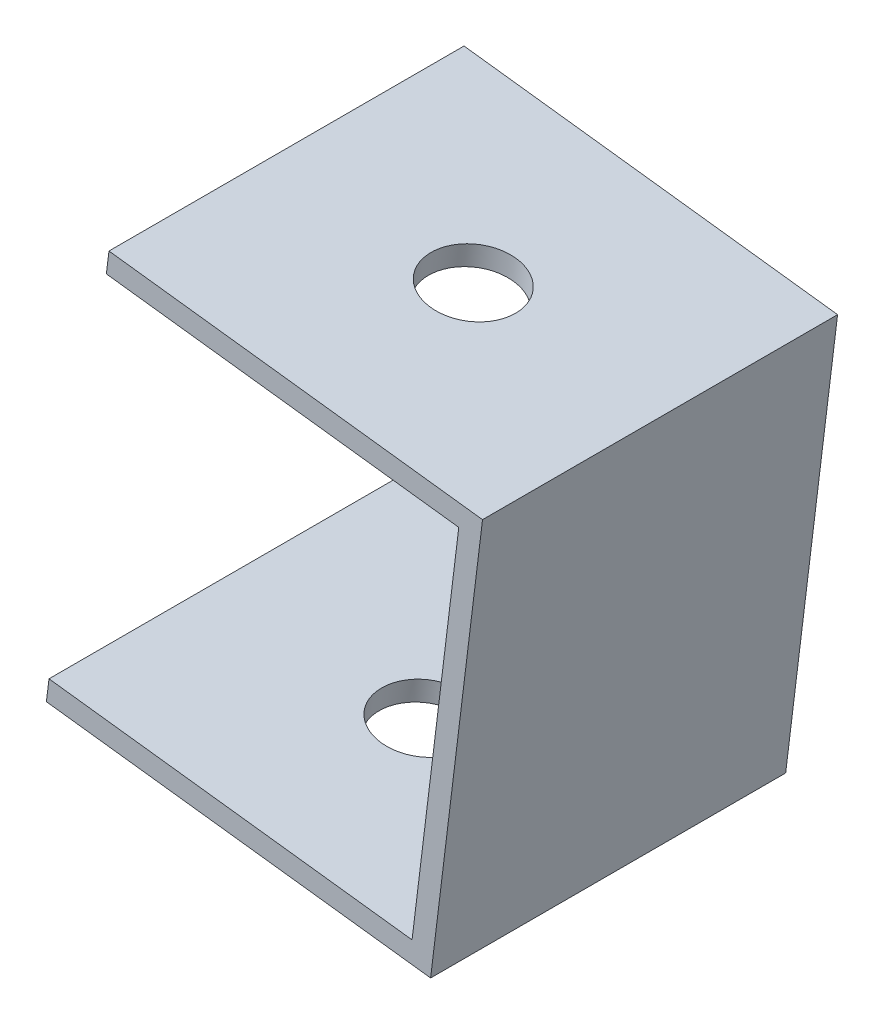
ISO-10303-21;
HEADER;
FILE_DESCRIPTION(('STEP AP214'),'2;1');
FILE_NAME('part.step','',(''),(''),'','','');
FILE_SCHEMA(('AUTOMOTIVE_DESIGN { 1 0 10303 214 1 1 1 1 }'));
ENDSEC;
DATA;
#1=APPLICATION_CONTEXT('core data for automotive mechanical design processes');
#2=APPLICATION_PROTOCOL_DEFINITION('international standard','automotive_design',2000,#1);
#3=PRODUCT_CONTEXT('',#1,'mechanical');
#4=PRODUCT('Part','Part','',(#3));
#5=PRODUCT_RELATED_PRODUCT_CATEGORY('part','',(#4));
#6=PRODUCT_DEFINITION_FORMATION('','',#4);
#7=PRODUCT_DEFINITION_CONTEXT('part definition',#1,'design');
#8=PRODUCT_DEFINITION('design','',#6,#7);
#9=PRODUCT_DEFINITION_SHAPE('','',#8);
#10=(LENGTH_UNIT() NAMED_UNIT(*) SI_UNIT(.MILLI.,.METRE.));
#11=(NAMED_UNIT(*) PLANE_ANGLE_UNIT() SI_UNIT($,.RADIAN.));
#12=(NAMED_UNIT(*) SI_UNIT($,.STERADIAN.) SOLID_ANGLE_UNIT());
#13=UNCERTAINTY_MEASURE_WITH_UNIT(LENGTH_MEASURE(1.E-05),#10,'distance_accuracy_value','');
#14=(GEOMETRIC_REPRESENTATION_CONTEXT(3) GLOBAL_UNCERTAINTY_ASSIGNED_CONTEXT((#13)) GLOBAL_UNIT_ASSIGNED_CONTEXT((#10,
#11,#12)) REPRESENTATION_CONTEXT('',''));
#15=CARTESIAN_POINT('',(0.,0.,0.));
#16=DIRECTION('',(0.,0.,1.));
#17=DIRECTION('',(1.,0.,0.));
#18=AXIS2_PLACEMENT_3D('',#15,#16,#17);
#19=CARTESIAN_POINT('',(-68.9551919595046,-1.53534912450742,47.7184680683861));
#20=DIRECTION('',(0.121869343405145,0.992546151641323,0.));
#21=DIRECTION('',(0.992546151641323,-0.121869343405145,0.));
#22=AXIS2_PLACEMENT_3D('',#19,#20,#21);
#23=PLANE('',#22);
#24=CARTESIAN_POINT('',(-41.1554688505947,-4.94872591965716,22.7184680683861));
#25=DIRECTION('',(-0.121869343405145,-0.992546151641323,0.));
#26=DIRECTION('',(0.992546151641323,-0.121869343405145,0.));
#27=AXIS2_PLACEMENT_3D('',#24,#25,#26);
#28=CIRCLE('',#27,6.00000000000001);
#29=CARTESIAN_POINT('',(-35.2001919407468,-5.67994198008803,22.7184680683861));
#30=VERTEX_POINT('',#29);
#31=EDGE_CURVE('E205',#30,#30,#28,.F.);
#32=ORIENTED_EDGE('',*,*,#31,.T.);
#33=EDGE_LOOP('',(#32));
#34=FACE_BOUND('',#33,.T.);
#35=DIRECTION('',(-0.992546151641322,0.121869343405145,0.));
#36=VECTOR('',#35,1.);
#37=CARTESIAN_POINT('',(-68.9551919595046,-1.53534912450742,-2.2815319316139));
#38=LINE('',#37,#36);
#39=CARTESIAN_POINT('',(-14.8529958320997,-8.17826351989349,-2.2815319316139));
#40=VERTEX_POINT('',#39);
#41=CARTESIAN_POINT('',(-68.9551919595046,-1.53534912450742,-2.2815319316139));
#42=VERTEX_POINT('',#41);
#43=EDGE_CURVE('E137',#40,#42,#38,.T.);
#44=ORIENTED_EDGE('',*,*,#43,.F.);
#45=DIRECTION('',(0.,0.,-1.));
#46=VECTOR('',#45,1.);
#47=CARTESIAN_POINT('',(-14.8529958320997,-8.17826351989349,47.7184680683861));
#48=LINE('',#47,#46);
#49=CARTESIAN_POINT('',(-14.8529958320997,-8.17826351989349,47.7184680683861));
#50=VERTEX_POINT('',#49);
#51=EDGE_CURVE('E136',#50,#40,#48,.T.);
#52=ORIENTED_EDGE('',*,*,#51,.F.);
#53=DIRECTION('',(-0.992546151641322,0.121869343405145,0.));
#54=VECTOR('',#53,1.);
#55=CARTESIAN_POINT('',(-68.9551919595046,-1.53534912450742,47.7184680683861));
#56=LINE('',#55,#54);
#57=CARTESIAN_POINT('',(-68.9551919595046,-1.53534912450742,47.7184680683861));
#58=VERTEX_POINT('',#57);
#59=EDGE_CURVE('E156',#50,#58,#56,.T.);
#60=ORIENTED_EDGE('',*,*,#59,.T.);
#61=DIRECTION('',(0.,0.,-1.));
#62=VECTOR('',#61,1.);
#63=CARTESIAN_POINT('',(-68.9551919595046,-1.53534912450742,47.7184680683861));
#64=LINE('',#63,#62);
#65=EDGE_CURVE('E11',#58,#42,#64,.T.);
#66=ORIENTED_EDGE('',*,*,#65,.T.);
#67=EDGE_LOOP('',(#44,#52,#60,#66));
#68=FACE_BOUND('',#67,.T.);
#69=ADVANCED_FACE('F41',(#34,#68),#23,.F.);
#70=CARTESIAN_POINT('',(-68.5895839292891,1.44228933041656,47.7184680683861));
#71=DIRECTION('',(0.992546151641322,-0.121869343405146,0.));
#72=DIRECTION('',(-0.121869343405146,-0.992546151641322,0.));
#73=AXIS2_PLACEMENT_3D('',#70,#71,#72);
#74=PLANE('',#73);
#75=DIRECTION('',(0.121869343405145,0.992546151641322,0.));
#76=VECTOR('',#75,1.);
#77=CARTESIAN_POINT('',(-68.5895839292891,1.44228933041656,-2.2815319316139));
#78=LINE('',#77,#76);
#79=CARTESIAN_POINT('',(-68.5895839292891,1.44228933041656,-2.2815319316139));
#80=VERTEX_POINT('',#79);
#81=EDGE_CURVE('E139',#42,#80,#78,.T.);
#82=ORIENTED_EDGE('',*,*,#81,.F.);
#83=ORIENTED_EDGE('',*,*,#65,.F.);
#84=DIRECTION('',(0.121869343405145,0.992546151641322,0.));
#85=VECTOR('',#84,1.);
#86=CARTESIAN_POINT('',(-68.5895839292891,1.44228933041656,47.7184680683861));
#87=LINE('',#86,#85);
#88=CARTESIAN_POINT('',(-68.5895839292891,1.44228933041656,47.7184680683861));
#89=VERTEX_POINT('',#88);
#90=EDGE_CURVE('E95',#58,#89,#87,.T.);
#91=ORIENTED_EDGE('',*,*,#90,.T.);
#92=DIRECTION('',(0.,0.,-1.));
#93=VECTOR('',#92,1.);
#94=CARTESIAN_POINT('',(-68.5895839292891,1.44228933041656,47.7184680683861));
#95=LINE('',#94,#93);
#96=EDGE_CURVE('E49',#89,#80,#95,.T.);
#97=ORIENTED_EDGE('',*,*,#96,.T.);
#98=EDGE_LOOP('',(#82,#83,#91,#97));
#99=FACE_BOUND('',#98,.T.);
#100=ADVANCED_FACE('F168',(#99),#74,.F.);
#101=CARTESIAN_POINT('',(-17.4650262568082,-4.83501703475412,47.7184680683861));
#102=DIRECTION('',(-0.121869343405145,-0.992546151641322,0.));
#103=DIRECTION('',(-0.992546151641322,0.121869343405145,0.));
#104=AXIS2_PLACEMENT_3D('',#101,#102,#103);
#105=PLANE('',#104);
#106=CARTESIAN_POINT('',(-40.7898608203793,-1.97108746473321,22.7184680683861));
#107=DIRECTION('',(0.121869343405145,0.992546151641322,0.));
#108=DIRECTION('',(-0.992546151641322,0.121869343405145,0.));
#109=AXIS2_PLACEMENT_3D('',#106,#107,#108);
#110=CIRCLE('',#109,6.00000000000001);
#111=CARTESIAN_POINT('',(-46.7451377302272,-1.23987140430233,22.7184680683861));
#112=VERTEX_POINT('',#111);
#113=EDGE_CURVE('E140',#112,#112,#110,.T.);
#114=ORIENTED_EDGE('',*,*,#113,.F.);
#115=EDGE_LOOP('',(#114));
#116=FACE_BOUND('',#115,.T.);
#117=DIRECTION('',(0.992546151641322,-0.121869343405145,0.));
#118=VECTOR('',#117,1.);
#119=CARTESIAN_POINT('',(-17.4650262568082,-4.83501703475412,-2.2815319316139));
#120=LINE('',#119,#118);
#121=CARTESIAN_POINT('',(-17.4650262568082,-4.83501703475412,-2.2815319316139));
#122=VERTEX_POINT('',#121);
#123=EDGE_CURVE('E143',#80,#122,#120,.T.);
#124=ORIENTED_EDGE('',*,*,#123,.F.);
#125=ORIENTED_EDGE('',*,*,#96,.F.);
#126=DIRECTION('',(0.992546151641322,-0.121869343405145,0.));
#127=VECTOR('',#126,1.);
#128=CARTESIAN_POINT('',(-17.4650262568082,-4.83501703475412,47.7184680683861));
#129=LINE('',#128,#127);
#130=CARTESIAN_POINT('',(-17.4650262568082,-4.83501703475412,47.7184680683861));
#131=VERTEX_POINT('',#130);
#132=EDGE_CURVE('E177',#89,#131,#129,.T.);
#133=ORIENTED_EDGE('',*,*,#132,.T.);
#134=DIRECTION('',(0.,0.,-1.));
#135=VECTOR('',#134,1.);
#136=CARTESIAN_POINT('',(-17.4650262568082,-4.83501703475412,47.7184680683861));
#137=LINE('',#136,#135);
#138=EDGE_CURVE('E163',#131,#122,#137,.T.);
#139=ORIENTED_EDGE('',*,*,#138,.T.);
#140=EDGE_LOOP('',(#124,#125,#133,#139));
#141=FACE_BOUND('',#140,.T.);
#142=ADVANCED_FACE('F189',(#116,#141),#105,.F.);
#143=CARTESIAN_POINT('',(-10.8840817129304,48.7624751538773,47.7184680683861));
#144=DIRECTION('',(0.992546151641322,-0.121869343405145,0.));
#145=DIRECTION('',(-0.121869343405145,-0.992546151641322,0.));
#146=AXIS2_PLACEMENT_3D('',#143,#144,#145);
#147=PLANE('',#146);
#148=DIRECTION('',(0.121869343405145,0.992546151641322,0.));
#149=VECTOR('',#148,1.);
#150=CARTESIAN_POINT('',(-10.8840817129304,48.7624751538773,-2.2815319316139));
#151=LINE('',#150,#149);
#152=CARTESIAN_POINT('',(-10.8840817129304,48.7624751538773,-2.2815319316139));
#153=VERTEX_POINT('',#152);
#154=EDGE_CURVE('E146',#122,#153,#151,.T.);
#155=ORIENTED_EDGE('',*,*,#154,.F.);
#156=ORIENTED_EDGE('',*,*,#138,.F.);
#157=DIRECTION('',(0.121869343405145,0.992546151641322,0.));
#158=VECTOR('',#157,1.);
#159=CARTESIAN_POINT('',(-10.8840817129304,48.7624751538773,47.7184680683861));
#160=LINE('',#159,#158);
#161=CARTESIAN_POINT('',(-10.8840817129304,48.7624751538773,47.7184680683861));
#162=VERTEX_POINT('',#161);
#163=EDGE_CURVE('E131',#131,#162,#160,.T.);
#164=ORIENTED_EDGE('',*,*,#163,.T.);
#165=DIRECTION('',(0.,0.,-1.));
#166=VECTOR('',#165,1.);
#167=CARTESIAN_POINT('',(-10.8840817129304,48.7624751538773,47.7184680683861));
#168=LINE('',#167,#166);
#169=EDGE_CURVE('E160',#162,#153,#168,.T.);
#170=ORIENTED_EDGE('',*,*,#169,.T.);
#171=EDGE_LOOP('',(#155,#156,#164,#170));
#172=FACE_BOUND('',#171,.T.);
#173=ADVANCED_FACE('F185',(#172),#147,.F.);
#174=CARTESIAN_POINT('',(-60.5113892949965,54.8559423241345,47.7184680683861));
#175=DIRECTION('',(0.121869343405145,0.992546151641322,0.));
#176=DIRECTION('',(0.992546151641322,-0.121869343405145,0.));
#177=AXIS2_PLACEMENT_3D('',#174,#175,#176);
#178=PLANE('',#177);
#179=CARTESIAN_POINT('',(-34.2089162765015,51.6264047238982,22.7184680683861));
#180=DIRECTION('',(-0.121869343405145,-0.992546151641322,0.));
#181=DIRECTION('',(0.992546151641322,-0.121869343405145,0.));
#182=AXIS2_PLACEMENT_3D('',#179,#180,#181);
#183=CIRCLE('',#182,6.00000000000001);
#184=CARTESIAN_POINT('',(-28.2536393666535,50.8951886634673,22.7184680683861));
#185=VERTEX_POINT('',#184);
#186=EDGE_CURVE('E207',#185,#185,#183,.T.);
#187=ORIENTED_EDGE('',*,*,#186,.F.);
#188=EDGE_LOOP('',(#187));
#189=FACE_BOUND('',#188,.T.);
#190=DIRECTION('',(-0.992546151641322,0.121869343405145,0.));
#191=VECTOR('',#190,1.);
#192=CARTESIAN_POINT('',(-60.5113892949965,54.8559423241345,-2.2815319316139));
#193=LINE('',#192,#191);
#194=CARTESIAN_POINT('',(-60.5113892949965,54.8559423241345,-2.2815319316139));
#195=VERTEX_POINT('',#194);
#196=EDGE_CURVE('E149',#153,#195,#193,.T.);
#197=ORIENTED_EDGE('',*,*,#196,.F.);
#198=ORIENTED_EDGE('',*,*,#169,.F.);
#199=DIRECTION('',(-0.992546151641322,0.121869343405145,0.));
#200=VECTOR('',#199,1.);
#201=CARTESIAN_POINT('',(-60.5113892949965,54.8559423241345,47.7184680683861));
#202=LINE('',#201,#200);
#203=CARTESIAN_POINT('',(-60.5113892949965,54.8559423241345,47.7184680683861));
#204=VERTEX_POINT('',#203);
#205=EDGE_CURVE('E129',#162,#204,#202,.T.);
#206=ORIENTED_EDGE('',*,*,#205,.T.);
#207=DIRECTION('',(0.,0.,-1.));
#208=VECTOR('',#207,1.);
#209=CARTESIAN_POINT('',(-60.5113892949965,54.8559423241345,47.7184680683861));
#210=LINE('',#209,#208);
#211=EDGE_CURVE('E123',#204,#195,#210,.T.);
#212=ORIENTED_EDGE('',*,*,#211,.T.);
#213=EDGE_LOOP('',(#197,#198,#206,#212));
#214=FACE_BOUND('',#213,.T.);
#215=ADVANCED_FACE('F188',(#189,#214),#178,.F.);
#216=CARTESIAN_POINT('',(-60.1457812647811,57.8335807790585,47.7184680683861));
#217=DIRECTION('',(0.992546151641322,-0.121869343405144,0.));
#218=DIRECTION('',(-0.121869343405144,-0.992546151641322,0.));
#219=AXIS2_PLACEMENT_3D('',#216,#217,#218);
#220=PLANE('',#219);
#221=DIRECTION('',(0.121869343405144,0.992546151641322,0.));
#222=VECTOR('',#221,1.);
#223=CARTESIAN_POINT('',(-60.1457812647811,57.8335807790585,-2.2815319316139));
#224=LINE('',#223,#222);
#225=CARTESIAN_POINT('',(-60.1457812647811,57.8335807790585,-2.2815319316139));
#226=VERTEX_POINT('',#225);
#227=EDGE_CURVE('E152',#195,#226,#224,.T.);
#228=ORIENTED_EDGE('',*,*,#227,.F.);
#229=ORIENTED_EDGE('',*,*,#211,.F.);
#230=DIRECTION('',(0.121869343405144,0.992546151641322,0.));
#231=VECTOR('',#230,1.);
#232=CARTESIAN_POINT('',(-60.1457812647811,57.8335807790585,47.7184680683861));
#233=LINE('',#232,#231);
#234=CARTESIAN_POINT('',(-60.1457812647811,57.8335807790585,47.7184680683861));
#235=VERTEX_POINT('',#234);
#236=EDGE_CURVE('E113',#204,#235,#233,.T.);
#237=ORIENTED_EDGE('',*,*,#236,.T.);
#238=DIRECTION('',(0.,0.,-1.));
#239=VECTOR('',#238,1.);
#240=CARTESIAN_POINT('',(-60.1457812647811,57.8335807790585,47.7184680683861));
#241=LINE('',#240,#239);
#242=EDGE_CURVE('E118',#235,#226,#241,.T.);
#243=ORIENTED_EDGE('',*,*,#242,.T.);
#244=EDGE_LOOP('',(#228,#229,#237,#243));
#245=FACE_BOUND('',#244,.T.);
#246=ADVANCED_FACE('F126',(#245),#220,.F.);
#247=CARTESIAN_POINT('',(-7.540835227791,51.3745055785858,47.7184680683861));
#248=DIRECTION('',(-0.121869343405145,-0.992546151641322,0.));
#249=DIRECTION('',(-0.992546151641322,0.121869343405145,0.));
#250=AXIS2_PLACEMENT_3D('',#247,#248,#249);
#251=PLANE('',#250);
#252=CARTESIAN_POINT('',(-33.843308246286,54.6040431788221,22.7184680683861));
#253=DIRECTION('',(-0.121869343405145,-0.992546151641322,0.));
#254=DIRECTION('',(0.992546151641322,-0.121869343405145,0.));
#255=AXIS2_PLACEMENT_3D('',#252,#253,#254);
#256=CIRCLE('',#255,6.00000000000001);
#257=CARTESIAN_POINT('',(-27.8880313364381,53.8728271183913,22.7184680683861));
#258=VERTEX_POINT('',#257);
#259=EDGE_CURVE('E208',#258,#258,#256,.T.);
#260=ORIENTED_EDGE('',*,*,#259,.T.);
#261=EDGE_LOOP('',(#260));
#262=FACE_BOUND('',#261,.T.);
#263=DIRECTION('',(0.992546151641322,-0.121869343405145,0.));
#264=VECTOR('',#263,1.);
#265=CARTESIAN_POINT('',(-7.540835227791,51.3745055785858,-2.2815319316139));
#266=LINE('',#265,#264);
#267=CARTESIAN_POINT('',(-7.540835227791,51.3745055785858,-2.2815319316139));
#268=VERTEX_POINT('',#267);
#269=EDGE_CURVE('E120',#226,#268,#266,.T.);
#270=ORIENTED_EDGE('',*,*,#269,.F.);
#271=ORIENTED_EDGE('',*,*,#242,.F.);
#272=DIRECTION('',(0.992546151641322,-0.121869343405145,0.));
#273=VECTOR('',#272,1.);
#274=CARTESIAN_POINT('',(-7.540835227791,51.3745055785858,47.7184680683861));
#275=LINE('',#274,#273);
#276=CARTESIAN_POINT('',(-7.540835227791,51.3745055785858,47.7184680683861));
#277=VERTEX_POINT('',#276);
#278=EDGE_CURVE('E109',#235,#277,#275,.T.);
#279=ORIENTED_EDGE('',*,*,#278,.T.);
#280=DIRECTION('',(0.,0.,-1.));
#281=VECTOR('',#280,1.);
#282=CARTESIAN_POINT('',(-7.540835227791,51.3745055785858,47.7184680683861));
#283=LINE('',#282,#281);
#284=EDGE_CURVE('E124',#277,#268,#283,.T.);
#285=ORIENTED_EDGE('',*,*,#284,.T.);
#286=EDGE_LOOP('',(#270,#271,#279,#285));
#287=FACE_BOUND('',#286,.T.);
#288=ADVANCED_FACE('F119',(#262,#287),#251,.F.);
#289=CARTESIAN_POINT('',(-14.8529958320997,-8.17826351989349,47.7184680683861));
#290=DIRECTION('',(-0.992546151641323,0.121869343405145,0.));
#291=DIRECTION('',(0.121869343405145,0.992546151641323,0.));
#292=AXIS2_PLACEMENT_3D('',#289,#290,#291);
#293=PLANE('',#292);
#294=DIRECTION('',(-0.121869343405145,-0.992546151641322,0.));
#295=VECTOR('',#294,1.);
#296=CARTESIAN_POINT('',(-14.8529958320997,-8.17826351989349,-2.2815319316139));
#297=LINE('',#296,#295);
#298=EDGE_CURVE('E83',#268,#40,#297,.T.);
#299=ORIENTED_EDGE('',*,*,#298,.F.);
#300=ORIENTED_EDGE('',*,*,#284,.F.);
#301=DIRECTION('',(-0.121869343405145,-0.992546151641322,0.));
#302=VECTOR('',#301,1.);
#303=CARTESIAN_POINT('',(-14.8529958320997,-8.17826351989349,47.7184680683861));
#304=LINE('',#303,#302);
#305=EDGE_CURVE('E57',#277,#50,#304,.T.);
#306=ORIENTED_EDGE('',*,*,#305,.T.);
#307=ORIENTED_EDGE('',*,*,#51,.T.);
#308=EDGE_LOOP('',(#299,#300,#306,#307));
#309=FACE_BOUND('',#308,.T.);
#310=ADVANCED_FACE('F232',(#309),#293,.F.);
#311=CARTESIAN_POINT('',(-14.8529958320997,-8.17826351989349,47.7184680683861));
#312=DIRECTION('',(0.,0.,-1.));
#313=DIRECTION('',(1.,0.,0.));
#314=AXIS2_PLACEMENT_3D('',#311,#312,#313);
#315=PLANE('',#314);
#316=ORIENTED_EDGE('',*,*,#59,.F.);
#317=ORIENTED_EDGE('',*,*,#305,.F.);
#318=ORIENTED_EDGE('',*,*,#278,.F.);
#319=ORIENTED_EDGE('',*,*,#236,.F.);
#320=ORIENTED_EDGE('',*,*,#205,.F.);
#321=ORIENTED_EDGE('',*,*,#163,.F.);
#322=ORIENTED_EDGE('',*,*,#132,.F.);
#323=ORIENTED_EDGE('',*,*,#90,.F.);
#324=EDGE_LOOP('',(#316,#317,#318,#319,#320,#321,#322,#323));
#325=FACE_BOUND('',#324,.T.);
#326=ADVANCED_FACE('F111',(#325),#315,.F.);
#327=CARTESIAN_POINT('',(-14.8529958320997,-8.17826351989349,-2.2815319316139));
#328=DIRECTION('',(0.,0.,-1.));
#329=DIRECTION('',(1.,0.,0.));
#330=AXIS2_PLACEMENT_3D('',#327,#328,#329);
#331=PLANE('',#330);
#332=ORIENTED_EDGE('',*,*,#43,.T.);
#333=ORIENTED_EDGE('',*,*,#81,.T.);
#334=ORIENTED_EDGE('',*,*,#123,.T.);
#335=ORIENTED_EDGE('',*,*,#154,.T.);
#336=ORIENTED_EDGE('',*,*,#196,.T.);
#337=ORIENTED_EDGE('',*,*,#227,.T.);
#338=ORIENTED_EDGE('',*,*,#269,.T.);
#339=ORIENTED_EDGE('',*,*,#298,.T.);
#340=EDGE_LOOP('',(#332,#333,#334,#335,#336,#337,#338,#339));
#341=FACE_BOUND('',#340,.T.);
#342=ADVANCED_FACE('F171',(#341),#331,.T.);
#343=CARTESIAN_POINT('',(-43.2236601899674,-21.7927926668458,22.7184680683861));
#344=DIRECTION('',(0.121869343405145,0.992546151641322,0.));
#345=DIRECTION('',(0.992546151641322,-0.121869343405145,0.));
#346=AXIS2_PLACEMENT_3D('',#343,#344,#345);
#347=CYLINDRICAL_SURFACE('',#346,6.00000000000001);
#348=ORIENTED_EDGE('',*,*,#259,.F.);
#349=EDGE_LOOP('',(#348));
#350=FACE_BOUND('',#349,.T.);
#351=ORIENTED_EDGE('',*,*,#186,.T.);
#352=EDGE_LOOP('',(#351));
#353=FACE_BOUND('',#352,.T.);
#354=ADVANCED_FACE('F216',(#350,#353),#347,.F.);
#355=ORIENTED_EDGE('',*,*,#31,.F.);
#356=EDGE_LOOP('',(#355));
#357=FACE_BOUND('',#356,.T.);
#358=ORIENTED_EDGE('',*,*,#113,.T.);
#359=EDGE_LOOP('',(#358));
#360=FACE_BOUND('',#359,.T.);
#361=ADVANCED_FACE('F219',(#357,#360),#347,.F.);
#362=CLOSED_SHELL('',(#69,#100,#142,#173,#215,#246,#288,#310,#326,#342,#354,#361));
#363=MANIFOLD_SOLID_BREP('B2',#362);
#364=ADVANCED_BREP_SHAPE_REPRESENTATION('',(#18,#363),#14);
#365=SHAPE_DEFINITION_REPRESENTATION(#9,#364);
ENDSEC;
END-ISO-10303-21;
